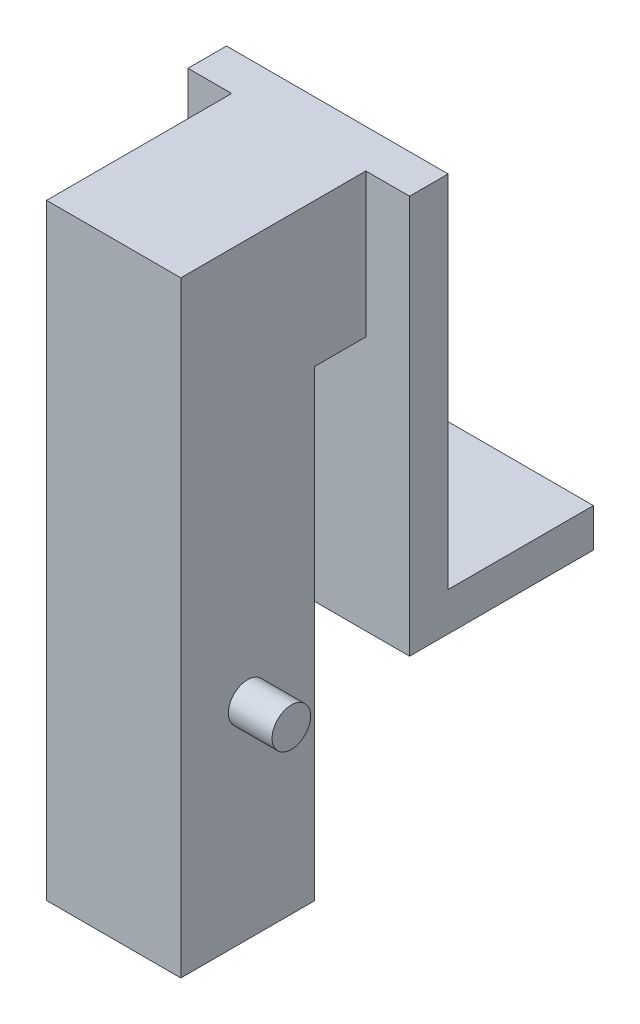
ISO-10303-21;
HEADER;
FILE_DESCRIPTION(('STEP AP214'),'2;1');
FILE_NAME('part.step','',(''),(''),'','','');
FILE_SCHEMA(('AUTOMOTIVE_DESIGN { 1 0 10303 214 1 1 1 1 }'));
ENDSEC;
DATA;
#1=APPLICATION_CONTEXT('core data for automotive mechanical design processes');
#2=APPLICATION_PROTOCOL_DEFINITION('international standard','automotive_design',2000,#1);
#3=PRODUCT_CONTEXT('',#1,'mechanical');
#4=PRODUCT('Part','Part','',(#3));
#5=PRODUCT_RELATED_PRODUCT_CATEGORY('part','',(#4));
#6=PRODUCT_DEFINITION_FORMATION('','',#4);
#7=PRODUCT_DEFINITION_CONTEXT('part definition',#1,'design');
#8=PRODUCT_DEFINITION('design','',#6,#7);
#9=PRODUCT_DEFINITION_SHAPE('','',#8);
#10=(LENGTH_UNIT() NAMED_UNIT(*) SI_UNIT(.MILLI.,.METRE.));
#11=(NAMED_UNIT(*) PLANE_ANGLE_UNIT() SI_UNIT($,.RADIAN.));
#12=(NAMED_UNIT(*) SI_UNIT($,.STERADIAN.) SOLID_ANGLE_UNIT());
#13=UNCERTAINTY_MEASURE_WITH_UNIT(LENGTH_MEASURE(1.E-05),#10,'distance_accuracy_value','');
#14=(GEOMETRIC_REPRESENTATION_CONTEXT(3) GLOBAL_UNCERTAINTY_ASSIGNED_CONTEXT((#13)) GLOBAL_UNIT_ASSIGNED_CONTEXT((#10,
#11,#12)) REPRESENTATION_CONTEXT('',''));
#15=CARTESIAN_POINT('',(0.,0.,0.));
#16=DIRECTION('',(0.,0.,1.));
#17=DIRECTION('',(1.,0.,0.));
#18=AXIS2_PLACEMENT_3D('',#15,#16,#17);
#19=CARTESIAN_POINT('',(-4.35201843167115,39.0974258328658,-10.4));
#20=DIRECTION('',(-1.,0.,0.));
#21=DIRECTION('',(0.,-1.,0.));
#22=AXIS2_PLACEMENT_3D('',#19,#20,#21);
#23=PLANE('',#22);
#24=DIRECTION('',(0.,0.,1.));
#25=VECTOR('',#24,1.);
#26=CARTESIAN_POINT('',(-4.35201843167114,-8.08331982571848,-10.4));
#27=LINE('',#26,#25);
#28=CARTESIAN_POINT('',(-4.35201843167114,-8.08331982571848,-10.4));
#29=VERTEX_POINT('',#28);
#30=CARTESIAN_POINT('',(-4.35201843167114,-8.08331982571848,0.));
#31=VERTEX_POINT('',#30);
#32=EDGE_CURVE('E483',#29,#31,#27,.T.);
#33=ORIENTED_EDGE('',*,*,#32,.T.);
#34=DIRECTION('',(0.,-1.,0.));
#35=VECTOR('',#34,1.);
#36=CARTESIAN_POINT('',(-4.35201843167115,39.0974258328658,0.));
#37=LINE('',#36,#35);
#38=CARTESIAN_POINT('',(-4.35201843167115,39.0974258328658,0.));
#39=VERTEX_POINT('',#38);
#40=EDGE_CURVE('E489',#39,#31,#37,.T.);
#41=ORIENTED_EDGE('',*,*,#40,.F.);
#42=DIRECTION('',(0.,0.,1.));
#43=VECTOR('',#42,1.);
#44=CARTESIAN_POINT('',(-4.35201843167115,39.0974258328658,-10.4));
#45=LINE('',#44,#43);
#46=CARTESIAN_POINT('',(-4.35201843167115,39.0974258328658,-14.4));
#47=VERTEX_POINT('',#46);
#48=EDGE_CURVE('E504',#47,#39,#45,.T.);
#49=ORIENTED_EDGE('',*,*,#48,.F.);
#50=DIRECTION('',(0.,1.,0.));
#51=VECTOR('',#50,1.);
#52=CARTESIAN_POINT('',(-4.35201843167115,27.9166801742815,-14.4));
#53=LINE('',#52,#51);
#54=CARTESIAN_POINT('',(-4.35201843167115,27.9166801742815,-14.4));
#55=VERTEX_POINT('',#54);
#56=EDGE_CURVE('E511',#55,#47,#53,.T.);
#57=ORIENTED_EDGE('',*,*,#56,.F.);
#58=DIRECTION('',(0.,0.,-1.));
#59=VECTOR('',#58,1.);
#60=CARTESIAN_POINT('',(-4.35201843167115,27.9166801742815,-14.4));
#61=LINE('',#60,#59);
#62=CARTESIAN_POINT('',(-4.35201843167115,27.9166801742815,-10.4));
#63=VERTEX_POINT('',#62);
#64=EDGE_CURVE('E515',#63,#55,#61,.T.);
#65=ORIENTED_EDGE('',*,*,#64,.F.);
#66=DIRECTION('',(0.,-1.,0.));
#67=VECTOR('',#66,1.);
#68=CARTESIAN_POINT('',(-4.35201843167115,39.0974258328658,-10.4));
#69=LINE('',#68,#67);
#70=EDGE_CURVE('E497',#63,#29,#69,.T.);
#71=ORIENTED_EDGE('',*,*,#70,.T.);
#72=EDGE_LOOP('',(#33,#41,#49,#57,#65,#71));
#73=FACE_BOUND('',#72,.T.);
#74=CARTESIAN_POINT('',(-4.35201843167115,7.91668017428152,-5.2));
#75=DIRECTION('',(-1.,0.,0.));
#76=DIRECTION('',(0.,-1.,0.));
#77=AXIS2_PLACEMENT_3D('',#74,#75,#76);
#78=CIRCLE('',#77,1.5);
#79=CARTESIAN_POINT('',(-4.35201843167115,6.41668017428152,-5.2));
#80=VERTEX_POINT('',#79);
#81=EDGE_CURVE('E13',#80,#80,#78,.T.);
#82=ORIENTED_EDGE('',*,*,#81,.F.);
#83=EDGE_LOOP('',(#82));
#84=FACE_BOUND('',#83,.T.);
#85=ADVANCED_FACE('F241',(#73,#84),#23,.T.);
#86=CARTESIAN_POINT('',(-4.35201843167115,39.0974258328658,-10.4));
#87=DIRECTION('',(0.,1.,0.));
#88=DIRECTION('',(0.,0.,1.));
#89=AXIS2_PLACEMENT_3D('',#86,#87,#88);
#90=PLANE('',#89);
#91=DIRECTION('',(-1.,0.,0.));
#92=VECTOR('',#91,1.);
#93=CARTESIAN_POINT('',(-4.35201843167115,39.0974258328658,0.));
#94=LINE('',#93,#92);
#95=CARTESIAN_POINT('',(6.09084293443147,39.0974258328658,0.));
#96=VERTEX_POINT('',#95);
#97=EDGE_CURVE('E452',#96,#39,#94,.T.);
#98=ORIENTED_EDGE('',*,*,#97,.F.);
#99=DIRECTION('',(0.,0.,1.));
#100=VECTOR('',#99,1.);
#101=CARTESIAN_POINT('',(6.09084293443147,39.0974258328658,-10.4));
#102=LINE('',#101,#100);
#103=CARTESIAN_POINT('',(6.09084293443147,39.0974258328658,-14.4));
#104=VERTEX_POINT('',#103);
#105=EDGE_CURVE('E499',#104,#96,#102,.T.);
#106=ORIENTED_EDGE('',*,*,#105,.F.);
#107=DIRECTION('',(1.,0.,0.));
#108=VECTOR('',#107,1.);
#109=CARTESIAN_POINT('',(9.49084293443147,39.0974258328658,-14.4));
#110=LINE('',#109,#108);
#111=CARTESIAN_POINT('',(9.49084293443147,39.0974258328658,-14.4));
#112=VERTEX_POINT('',#111);
#113=EDGE_CURVE('E418',#104,#112,#110,.T.);
#114=ORIENTED_EDGE('',*,*,#113,.T.);
#115=DIRECTION('',(0.,0.,1.));
#116=VECTOR('',#115,1.);
#117=CARTESIAN_POINT('',(9.49084293443147,39.0974258328658,-17.4));
#118=LINE('',#117,#116);
#119=CARTESIAN_POINT('',(9.49084293443147,39.0974258328658,-17.4));
#120=VERTEX_POINT('',#119);
#121=EDGE_CURVE('E428',#120,#112,#118,.T.);
#122=ORIENTED_EDGE('',*,*,#121,.F.);
#123=DIRECTION('',(1.,0.,0.));
#124=VECTOR('',#123,1.);
#125=CARTESIAN_POINT('',(9.49084293443147,39.0974258328658,-17.4));
#126=LINE('',#125,#124);
#127=CARTESIAN_POINT('',(-7.75201843167115,39.0974258328658,-17.4));
#128=VERTEX_POINT('',#127);
#129=EDGE_CURVE('E412',#128,#120,#126,.T.);
#130=ORIENTED_EDGE('',*,*,#129,.F.);
#131=DIRECTION('',(0.,0.,1.));
#132=VECTOR('',#131,1.);
#133=CARTESIAN_POINT('',(-7.75201843167115,39.0974258328658,-17.4));
#134=LINE('',#133,#132);
#135=CARTESIAN_POINT('',(-7.75201843167115,39.0974258328658,-14.4));
#136=VERTEX_POINT('',#135);
#137=EDGE_CURVE('E437',#128,#136,#134,.T.);
#138=ORIENTED_EDGE('',*,*,#137,.T.);
#139=EDGE_CURVE('E414',#136,#47,#110,.T.);
#140=ORIENTED_EDGE('',*,*,#139,.T.);
#141=ORIENTED_EDGE('',*,*,#48,.T.);
#142=EDGE_LOOP('',(#98,#106,#114,#122,#130,#138,#140,#141));
#143=FACE_BOUND('',#142,.T.);
#144=ADVANCED_FACE('F450',(#143),#90,.T.);
#145=CARTESIAN_POINT('',(6.09084293443147,39.0974258328658,-10.4));
#146=DIRECTION('',(1.,0.,0.));
#147=DIRECTION('',(0.,1.,0.));
#148=AXIS2_PLACEMENT_3D('',#145,#146,#147);
#149=PLANE('',#148);
#150=DIRECTION('',(0.,1.,0.));
#151=VECTOR('',#150,1.);
#152=CARTESIAN_POINT('',(6.09084293443147,39.0974258328658,-10.4));
#153=LINE('',#152,#151);
#154=CARTESIAN_POINT('',(6.09084293443147,-8.08331982571848,-10.4));
#155=VERTEX_POINT('',#154);
#156=CARTESIAN_POINT('',(6.09084293443147,27.9166801742815,-10.4));
#157=VERTEX_POINT('',#156);
#158=EDGE_CURVE('E501',#155,#157,#153,.T.);
#159=ORIENTED_EDGE('',*,*,#158,.T.);
#160=DIRECTION('',(0.,0.,-1.));
#161=VECTOR('',#160,1.);
#162=CARTESIAN_POINT('',(6.09084293443147,27.9166801742815,-14.4));
#163=LINE('',#162,#161);
#164=CARTESIAN_POINT('',(6.09084293443147,27.9166801742815,-14.4));
#165=VERTEX_POINT('',#164);
#166=EDGE_CURVE('E258',#157,#165,#163,.T.);
#167=ORIENTED_EDGE('',*,*,#166,.T.);
#168=DIRECTION('',(0.,1.,0.));
#169=VECTOR('',#168,1.);
#170=CARTESIAN_POINT('',(6.09084293443147,27.9166801742815,-14.4));
#171=LINE('',#170,#169);
#172=EDGE_CURVE('E439',#165,#104,#171,.T.);
#173=ORIENTED_EDGE('',*,*,#172,.T.);
#174=ORIENTED_EDGE('',*,*,#105,.T.);
#175=DIRECTION('',(0.,1.,0.));
#176=VECTOR('',#175,1.);
#177=CARTESIAN_POINT('',(6.09084293443147,39.0974258328658,0.));
#178=LINE('',#177,#176);
#179=CARTESIAN_POINT('',(6.09084293443147,-8.08331982571848,0.));
#180=VERTEX_POINT('',#179);
#181=EDGE_CURVE('E488',#180,#96,#178,.T.);
#182=ORIENTED_EDGE('',*,*,#181,.F.);
#183=DIRECTION('',(0.,0.,1.));
#184=VECTOR('',#183,1.);
#185=CARTESIAN_POINT('',(6.09084293443147,-8.08331982571848,-10.4));
#186=LINE('',#185,#184);
#187=EDGE_CURVE('E485',#155,#180,#186,.T.);
#188=ORIENTED_EDGE('',*,*,#187,.F.);
#189=EDGE_LOOP('',(#159,#167,#173,#174,#182,#188));
#190=FACE_BOUND('',#189,.T.);
#191=CARTESIAN_POINT('',(6.09084293443147,7.91668017428152,-5.2));
#192=DIRECTION('',(1.,0.,0.));
#193=DIRECTION('',(0.,1.,0.));
#194=AXIS2_PLACEMENT_3D('',#191,#192,#193);
#195=CIRCLE('',#194,1.5);
#196=CARTESIAN_POINT('',(6.09084293443147,9.41668017428152,-5.2));
#197=VERTEX_POINT('',#196);
#198=EDGE_CURVE('E250',#197,#197,#195,.T.);
#199=ORIENTED_EDGE('',*,*,#198,.F.);
#200=EDGE_LOOP('',(#199));
#201=FACE_BOUND('',#200,.T.);
#202=ADVANCED_FACE('F454',(#190,#201),#149,.T.);
#203=CARTESIAN_POINT('',(-4.35201843167114,-8.08331982571848,-10.4));
#204=DIRECTION('',(0.,-1.,0.));
#205=DIRECTION('',(1.,0.,0.));
#206=AXIS2_PLACEMENT_3D('',#203,#204,#205);
#207=PLANE('',#206);
#208=DIRECTION('',(0.,0.,1.));
#209=VECTOR('',#208,1.);
#210=CARTESIAN_POINT('',(3.09084293443148,-8.08331982571848,-3.));
#211=LINE('',#210,#209);
#212=CARTESIAN_POINT('',(3.09084293443148,-8.08331982571848,-7.4));
#213=VERTEX_POINT('',#212);
#214=CARTESIAN_POINT('',(3.09084293443148,-8.08331982571848,-3.));
#215=VERTEX_POINT('',#214);
#216=EDGE_CURVE('E266',#213,#215,#211,.T.);
#217=ORIENTED_EDGE('',*,*,#216,.F.);
#218=DIRECTION('',(1.,0.,0.));
#219=VECTOR('',#218,1.);
#220=CARTESIAN_POINT('',(-1.35201843167114,-8.08331982571848,-7.4));
#221=LINE('',#220,#219);
#222=CARTESIAN_POINT('',(-1.35201843167114,-8.08331982571848,-7.4));
#223=VERTEX_POINT('',#222);
#224=EDGE_CURVE('E534',#223,#213,#221,.T.);
#225=ORIENTED_EDGE('',*,*,#224,.F.);
#226=DIRECTION('',(0.,0.,-1.));
#227=VECTOR('',#226,1.);
#228=CARTESIAN_POINT('',(-1.35201843167114,-8.08331982571848,-3.));
#229=LINE('',#228,#227);
#230=CARTESIAN_POINT('',(-1.35201843167114,-8.08331982571848,-3.));
#231=VERTEX_POINT('',#230);
#232=EDGE_CURVE('E548',#231,#223,#229,.T.);
#233=ORIENTED_EDGE('',*,*,#232,.F.);
#234=DIRECTION('',(-1.,0.,0.));
#235=VECTOR('',#234,1.);
#236=CARTESIAN_POINT('',(-1.35201843167114,-8.08331982571848,-3.));
#237=LINE('',#236,#235);
#238=EDGE_CURVE('E545',#215,#231,#237,.T.);
#239=ORIENTED_EDGE('',*,*,#238,.F.);
#240=EDGE_LOOP('',(#217,#225,#233,#239));
#241=FACE_BOUND('',#240,.T.);
#242=DIRECTION('',(1.,0.,0.));
#243=VECTOR('',#242,1.);
#244=CARTESIAN_POINT('',(-4.35201843167114,-8.08331982571848,0.));
#245=LINE('',#244,#243);
#246=EDGE_CURVE('E480',#31,#180,#245,.T.);
#247=ORIENTED_EDGE('',*,*,#246,.F.);
#248=ORIENTED_EDGE('',*,*,#32,.F.);
#249=DIRECTION('',(1.,0.,0.));
#250=VECTOR('',#249,1.);
#251=CARTESIAN_POINT('',(-4.35201843167114,-8.08331982571848,-10.4));
#252=LINE('',#251,#250);
#253=EDGE_CURVE('E560',#29,#155,#252,.T.);
#254=ORIENTED_EDGE('',*,*,#253,.T.);
#255=ORIENTED_EDGE('',*,*,#187,.T.);
#256=EDGE_LOOP('',(#247,#248,#254,#255));
#257=FACE_BOUND('',#256,.T.);
#258=ADVANCED_FACE('F460',(#241,#257),#207,.T.);
#259=CARTESIAN_POINT('',(0.,0.,-10.4));
#260=DIRECTION('',(0.,0.,1.));
#261=DIRECTION('',(1.,0.,0.));
#262=AXIS2_PLACEMENT_3D('',#259,#260,#261);
#263=PLANE('',#262);
#264=ORIENTED_EDGE('',*,*,#70,.F.);
#265=DIRECTION('',(1.,0.,0.));
#266=VECTOR('',#265,1.);
#267=CARTESIAN_POINT('',(0.,27.9166801742815,-10.4));
#268=LINE('',#267,#266);
#269=EDGE_CURVE('E520',#63,#157,#268,.T.);
#270=ORIENTED_EDGE('',*,*,#269,.T.);
#271=ORIENTED_EDGE('',*,*,#158,.F.);
#272=ORIENTED_EDGE('',*,*,#253,.F.);
#273=EDGE_LOOP('',(#264,#270,#271,#272));
#274=FACE_BOUND('',#273,.T.);
#275=ADVANCED_FACE('F468',(#274),#263,.F.);
#276=CARTESIAN_POINT('',(0.,0.,0.));
#277=DIRECTION('',(0.,0.,1.));
#278=DIRECTION('',(1.,0.,0.));
#279=AXIS2_PLACEMENT_3D('',#276,#277,#278);
#280=PLANE('',#279);
#281=ORIENTED_EDGE('',*,*,#181,.T.);
#282=ORIENTED_EDGE('',*,*,#97,.T.);
#283=ORIENTED_EDGE('',*,*,#40,.T.);
#284=ORIENTED_EDGE('',*,*,#246,.T.);
#285=EDGE_LOOP('',(#281,#282,#283,#284));
#286=FACE_BOUND('',#285,.T.);
#287=ADVANCED_FACE('F465',(#286),#280,.T.);
#288=CARTESIAN_POINT('',(3.09084293443148,16.9166801742815,-3.));
#289=DIRECTION('',(1.,0.,0.));
#290=DIRECTION('',(0.,0.,-1.));
#291=AXIS2_PLACEMENT_3D('',#288,#289,#290);
#292=PLANE('',#291);
#293=ORIENTED_EDGE('',*,*,#216,.T.);
#294=DIRECTION('',(0.,-1.,0.));
#295=VECTOR('',#294,1.);
#296=CARTESIAN_POINT('',(3.09084293443148,16.9166801742815,-3.));
#297=LINE('',#296,#295);
#298=CARTESIAN_POINT('',(3.09084293443148,16.9166801742815,-3.));
#299=VERTEX_POINT('',#298);
#300=EDGE_CURVE('E543',#299,#215,#297,.T.);
#301=ORIENTED_EDGE('',*,*,#300,.F.);
#302=DIRECTION('',(0.,0.,1.));
#303=VECTOR('',#302,1.);
#304=CARTESIAN_POINT('',(3.09084293443148,16.9166801742815,-3.));
#305=LINE('',#304,#303);
#306=CARTESIAN_POINT('',(3.09084293443148,16.9166801742815,-7.4));
#307=VERTEX_POINT('',#306);
#308=EDGE_CURVE('E530',#307,#299,#305,.T.);
#309=ORIENTED_EDGE('',*,*,#308,.F.);
#310=DIRECTION('',(0.,-1.,0.));
#311=VECTOR('',#310,1.);
#312=CARTESIAN_POINT('',(3.09084293443148,16.9166801742815,-7.4));
#313=LINE('',#312,#311);
#314=EDGE_CURVE('E492',#307,#213,#313,.T.);
#315=ORIENTED_EDGE('',*,*,#314,.T.);
#316=EDGE_LOOP('',(#293,#301,#309,#315));
#317=FACE_BOUND('',#316,.T.);
#318=ADVANCED_FACE('F572',(#317),#292,.F.);
#319=CARTESIAN_POINT('',(-1.35201843167114,16.9166801742815,-7.4));
#320=DIRECTION('',(0.,0.,-1.));
#321=DIRECTION('',(-1.,0.,0.));
#322=AXIS2_PLACEMENT_3D('',#319,#320,#321);
#323=PLANE('',#322);
#324=ORIENTED_EDGE('',*,*,#224,.T.);
#325=ORIENTED_EDGE('',*,*,#314,.F.);
#326=DIRECTION('',(1.,0.,0.));
#327=VECTOR('',#326,1.);
#328=CARTESIAN_POINT('',(-1.35201843167114,16.9166801742815,-7.4));
#329=LINE('',#328,#327);
#330=CARTESIAN_POINT('',(-1.35201843167114,16.9166801742815,-7.4));
#331=VERTEX_POINT('',#330);
#332=EDGE_CURVE('E540',#331,#307,#329,.T.);
#333=ORIENTED_EDGE('',*,*,#332,.F.);
#334=DIRECTION('',(0.,-1.,0.));
#335=VECTOR('',#334,1.);
#336=CARTESIAN_POINT('',(-1.35201843167114,16.9166801742815,-7.4));
#337=LINE('',#336,#335);
#338=EDGE_CURVE('E554',#331,#223,#337,.T.);
#339=ORIENTED_EDGE('',*,*,#338,.T.);
#340=EDGE_LOOP('',(#324,#325,#333,#339));
#341=FACE_BOUND('',#340,.T.);
#342=ADVANCED_FACE('F576',(#341),#323,.F.);
#343=CARTESIAN_POINT('',(-1.35201843167114,16.9166801742815,-3.));
#344=DIRECTION('',(-1.,0.,0.));
#345=DIRECTION('',(0.,0.,1.));
#346=AXIS2_PLACEMENT_3D('',#343,#344,#345);
#347=PLANE('',#346);
#348=ORIENTED_EDGE('',*,*,#232,.T.);
#349=ORIENTED_EDGE('',*,*,#338,.F.);
#350=DIRECTION('',(0.,0.,-1.));
#351=VECTOR('',#350,1.);
#352=CARTESIAN_POINT('',(-1.35201843167114,16.9166801742815,-3.));
#353=LINE('',#352,#351);
#354=CARTESIAN_POINT('',(-1.35201843167114,16.9166801742815,-3.));
#355=VERTEX_POINT('',#354);
#356=EDGE_CURVE('E537',#355,#331,#353,.T.);
#357=ORIENTED_EDGE('',*,*,#356,.F.);
#358=DIRECTION('',(0.,-1.,0.));
#359=VECTOR('',#358,1.);
#360=CARTESIAN_POINT('',(-1.35201843167114,16.9166801742815,-3.));
#361=LINE('',#360,#359);
#362=EDGE_CURVE('E556',#355,#231,#361,.T.);
#363=ORIENTED_EDGE('',*,*,#362,.T.);
#364=EDGE_LOOP('',(#348,#349,#357,#363));
#365=FACE_BOUND('',#364,.T.);
#366=ADVANCED_FACE('F581',(#365),#347,.F.);
#367=CARTESIAN_POINT('',(-1.35201843167114,16.9166801742815,-3.));
#368=DIRECTION('',(0.,0.,1.));
#369=DIRECTION('',(1.,0.,0.));
#370=AXIS2_PLACEMENT_3D('',#367,#368,#369);
#371=PLANE('',#370);
#372=ORIENTED_EDGE('',*,*,#238,.T.);
#373=ORIENTED_EDGE('',*,*,#362,.F.);
#374=DIRECTION('',(-1.,0.,0.));
#375=VECTOR('',#374,1.);
#376=CARTESIAN_POINT('',(-1.35201843167114,16.9166801742815,-3.));
#377=LINE('',#376,#375);
#378=EDGE_CURVE('E533',#299,#355,#377,.T.);
#379=ORIENTED_EDGE('',*,*,#378,.F.);
#380=ORIENTED_EDGE('',*,*,#300,.T.);
#381=EDGE_LOOP('',(#372,#373,#379,#380));
#382=FACE_BOUND('',#381,.T.);
#383=ADVANCED_FACE('F585',(#382),#371,.F.);
#384=CARTESIAN_POINT('',(0.,16.9166801742815,0.));
#385=DIRECTION('',(0.,-1.,0.));
#386=DIRECTION('',(0.,0.,-1.));
#387=AXIS2_PLACEMENT_3D('',#384,#385,#386);
#388=PLANE('',#387);
#389=ORIENTED_EDGE('',*,*,#308,.T.);
#390=ORIENTED_EDGE('',*,*,#378,.T.);
#391=ORIENTED_EDGE('',*,*,#356,.T.);
#392=ORIENTED_EDGE('',*,*,#332,.T.);
#393=EDGE_LOOP('',(#389,#390,#391,#392));
#394=FACE_BOUND('',#393,.T.);
#395=ADVANCED_FACE('F588',(#394),#388,.T.);
#396=CARTESIAN_POINT('',(6.09084293443147,7.91668017428152,-5.2));
#397=DIRECTION('',(1.,0.,0.));
#398=DIRECTION('',(0.,1.,0.));
#399=AXIS2_PLACEMENT_3D('',#396,#397,#398);
#400=CYLINDRICAL_SURFACE('',#399,1.5);
#401=CARTESIAN_POINT('',(9.49084293443147,7.91668017428152,-5.2));
#402=DIRECTION('',(1.,0.,0.));
#403=DIRECTION('',(0.,1.,0.));
#404=AXIS2_PLACEMENT_3D('',#401,#402,#403);
#405=CIRCLE('',#404,1.5);
#406=CARTESIAN_POINT('',(9.49084293443147,9.41668017428152,-5.2));
#407=VERTEX_POINT('',#406);
#408=EDGE_CURVE('E526',#407,#407,#405,.T.);
#409=ORIENTED_EDGE('',*,*,#408,.F.);
#410=EDGE_LOOP('',(#409));
#411=FACE_BOUND('',#410,.T.);
#412=ORIENTED_EDGE('',*,*,#198,.T.);
#413=EDGE_LOOP('',(#412));
#414=FACE_BOUND('',#413,.T.);
#415=ADVANCED_FACE('F595',(#411,#414),#400,.T.);
#416=CARTESIAN_POINT('',(9.49084293443147,39.0974258328658,-10.4));
#417=DIRECTION('',(1.,0.,0.));
#418=DIRECTION('',(0.,1.,0.));
#419=AXIS2_PLACEMENT_3D('',#416,#417,#418);
#420=PLANE('',#419);
#421=ORIENTED_EDGE('',*,*,#408,.T.);
#422=EDGE_LOOP('',(#421));
#423=FACE_BOUND('',#422,.T.);
#424=ADVANCED_FACE('F599',(#423),#420,.T.);
#425=CARTESIAN_POINT('',(-4.35201843167115,7.91668017428152,-5.2));
#426=DIRECTION('',(1.,0.,0.));
#427=DIRECTION('',(0.,1.,0.));
#428=AXIS2_PLACEMENT_3D('',#425,#426,#427);
#429=CYLINDRICAL_SURFACE('',#428,1.5);
#430=ORIENTED_EDGE('',*,*,#81,.T.);
#431=EDGE_LOOP('',(#430));
#432=FACE_BOUND('',#431,.T.);
#433=CARTESIAN_POINT('',(-7.75201843167115,7.91668017428152,-5.2));
#434=DIRECTION('',(1.,0.,0.));
#435=DIRECTION('',(0.,1.,0.));
#436=AXIS2_PLACEMENT_3D('',#433,#434,#435);
#437=CIRCLE('',#436,1.5);
#438=CARTESIAN_POINT('',(-7.75201843167115,9.41668017428152,-5.2));
#439=VERTEX_POINT('',#438);
#440=EDGE_CURVE('E522',#439,#439,#437,.T.);
#441=ORIENTED_EDGE('',*,*,#440,.T.);
#442=EDGE_LOOP('',(#441));
#443=FACE_BOUND('',#442,.T.);
#444=ADVANCED_FACE('F603',(#432,#443),#429,.T.);
#445=CARTESIAN_POINT('',(-7.75201843167115,39.0974258328658,-10.4));
#446=DIRECTION('',(-1.,0.,0.));
#447=DIRECTION('',(0.,-1.,0.));
#448=AXIS2_PLACEMENT_3D('',#445,#446,#447);
#449=PLANE('',#448);
#450=ORIENTED_EDGE('',*,*,#440,.F.);
#451=EDGE_LOOP('',(#450));
#452=FACE_BOUND('',#451,.T.);
#453=ADVANCED_FACE('F607',(#452),#449,.T.);
#454=CARTESIAN_POINT('',(-22.5830105462532,27.9166801742815,-14.4));
#455=DIRECTION('',(0.,-1.,0.));
#456=DIRECTION('',(0.,0.,-1.));
#457=AXIS2_PLACEMENT_3D('',#454,#455,#456);
#458=PLANE('',#457);
#459=ORIENTED_EDGE('',*,*,#269,.F.);
#460=ORIENTED_EDGE('',*,*,#64,.T.);
#461=DIRECTION('',(1.,0.,0.));
#462=VECTOR('',#461,1.);
#463=CARTESIAN_POINT('',(-22.5830105462532,27.9166801742815,-14.4));
#464=LINE('',#463,#462);
#465=EDGE_CURVE('E518',#55,#165,#464,.T.);
#466=ORIENTED_EDGE('',*,*,#465,.T.);
#467=ORIENTED_EDGE('',*,*,#166,.F.);
#468=EDGE_LOOP('',(#459,#460,#466,#467));
#469=FACE_BOUND('',#468,.T.);
#470=ADVANCED_FACE('F566',(#469),#458,.T.);
#471=CARTESIAN_POINT('',(0.,0.,-14.4));
#472=DIRECTION('',(0.,0.,-1.));
#473=DIRECTION('',(-1.,0.,0.));
#474=AXIS2_PLACEMENT_3D('',#471,#472,#473);
#475=PLANE('',#474);
#476=ORIENTED_EDGE('',*,*,#465,.F.);
#477=ORIENTED_EDGE('',*,*,#56,.T.);
#478=ORIENTED_EDGE('',*,*,#139,.F.);
#479=DIRECTION('',(0.,1.,0.));
#480=VECTOR('',#479,1.);
#481=CARTESIAN_POINT('',(-7.75201843167115,39.0974258328658,-14.4));
#482=LINE('',#481,#480);
#483=CARTESIAN_POINT('',(-7.75201843167115,8.09742583286584,-14.4));
#484=VERTEX_POINT('',#483);
#485=EDGE_CURVE('E384',#484,#136,#482,.T.);
#486=ORIENTED_EDGE('',*,*,#485,.F.);
#487=DIRECTION('',(-1.,0.,0.));
#488=VECTOR('',#487,1.);
#489=CARTESIAN_POINT('',(-7.75201843167115,8.09742583286584,-14.4));
#490=LINE('',#489,#488);
#491=CARTESIAN_POINT('',(9.49084293443147,8.09742583286584,-14.4));
#492=VERTEX_POINT('',#491);
#493=EDGE_CURVE('E374',#492,#484,#490,.T.);
#494=ORIENTED_EDGE('',*,*,#493,.F.);
#495=DIRECTION('',(0.,-1.,0.));
#496=VECTOR('',#495,1.);
#497=CARTESIAN_POINT('',(9.49084293443147,39.0974258328658,-14.4));
#498=LINE('',#497,#496);
#499=EDGE_CURVE('E382',#112,#492,#498,.T.);
#500=ORIENTED_EDGE('',*,*,#499,.F.);
#501=ORIENTED_EDGE('',*,*,#113,.F.);
#502=ORIENTED_EDGE('',*,*,#172,.F.);
#503=EDGE_LOOP('',(#476,#477,#478,#486,#494,#500,#501,#502));
#504=FACE_BOUND('',#503,.T.);
#505=ADVANCED_FACE('F447',(#504),#475,.F.);
#506=CARTESIAN_POINT('',(9.49084293443147,39.0974258328658,-17.4));
#507=DIRECTION('',(-1.,0.,0.));
#508=DIRECTION('',(0.,-1.,0.));
#509=AXIS2_PLACEMENT_3D('',#506,#507,#508);
#510=PLANE('',#509);
#511=ORIENTED_EDGE('',*,*,#499,.T.);
#512=DIRECTION('',(0.,0.,1.));
#513=VECTOR('',#512,1.);
#514=CARTESIAN_POINT('',(9.49084293443147,8.09742583286584,-14.4));
#515=LINE('',#514,#513);
#516=CARTESIAN_POINT('',(9.49084293443147,8.09742583286584,-28.7050379200646));
#517=VERTEX_POINT('',#516);
#518=EDGE_CURVE('E367',#517,#492,#515,.T.);
#519=ORIENTED_EDGE('',*,*,#518,.F.);
#520=DIRECTION('',(0.,1.,0.));
#521=VECTOR('',#520,1.);
#522=CARTESIAN_POINT('',(9.49084293443147,8.09742583286584,-28.7050379200646));
#523=LINE('',#522,#521);
#524=CARTESIAN_POINT('',(9.49084293443147,11.0974258328658,-28.7050379200646));
#525=VERTEX_POINT('',#524);
#526=EDGE_CURVE('E363',#517,#525,#523,.T.);
#527=ORIENTED_EDGE('',*,*,#526,.T.);
#528=DIRECTION('',(0.,0.,1.));
#529=VECTOR('',#528,1.);
#530=CARTESIAN_POINT('',(9.49084293443147,11.0974258328658,-14.4));
#531=LINE('',#530,#529);
#532=CARTESIAN_POINT('',(9.49084293443147,11.0974258328658,-17.4));
#533=VERTEX_POINT('',#532);
#534=EDGE_CURVE('E376',#525,#533,#531,.T.);
#535=ORIENTED_EDGE('',*,*,#534,.T.);
#536=DIRECTION('',(0.,-1.,0.));
#537=VECTOR('',#536,1.);
#538=CARTESIAN_POINT('',(9.49084293443147,39.0974258328658,-17.4));
#539=LINE('',#538,#537);
#540=EDGE_CURVE('E405',#120,#533,#539,.T.);
#541=ORIENTED_EDGE('',*,*,#540,.F.);
#542=ORIENTED_EDGE('',*,*,#121,.T.);
#543=EDGE_LOOP('',(#511,#519,#527,#535,#541,#542));
#544=FACE_BOUND('',#543,.T.);
#545=ADVANCED_FACE('F403',(#544),#510,.F.);
#546=CARTESIAN_POINT('',(-7.75201843167115,39.0974258328658,-17.4));
#547=DIRECTION('',(1.,0.,0.));
#548=DIRECTION('',(0.,0.,-1.));
#549=AXIS2_PLACEMENT_3D('',#546,#547,#548);
#550=PLANE('',#549);
#551=ORIENTED_EDGE('',*,*,#485,.T.);
#552=ORIENTED_EDGE('',*,*,#137,.F.);
#553=DIRECTION('',(0.,1.,0.));
#554=VECTOR('',#553,1.);
#555=CARTESIAN_POINT('',(-7.75201843167115,39.0974258328658,-17.4));
#556=LINE('',#555,#554);
#557=CARTESIAN_POINT('',(-7.75201843167115,11.0974258328658,-17.4));
#558=VERTEX_POINT('',#557);
#559=EDGE_CURVE('E415',#558,#128,#556,.T.);
#560=ORIENTED_EDGE('',*,*,#559,.F.);
#561=DIRECTION('',(0.,0.,-1.));
#562=VECTOR('',#561,1.);
#563=CARTESIAN_POINT('',(-7.75201843167115,11.0974258328658,-14.4));
#564=LINE('',#563,#562);
#565=CARTESIAN_POINT('',(-7.75201843167115,11.0974258328658,-28.7050379200646));
#566=VERTEX_POINT('',#565);
#567=EDGE_CURVE('E380',#558,#566,#564,.T.);
#568=ORIENTED_EDGE('',*,*,#567,.T.);
#569=DIRECTION('',(0.,1.,0.));
#570=VECTOR('',#569,1.);
#571=CARTESIAN_POINT('',(-7.75201843167115,8.09742583286584,-28.7050379200646));
#572=LINE('',#571,#570);
#573=CARTESIAN_POINT('',(-7.75201843167115,8.09742583286584,-28.7050379200646));
#574=VERTEX_POINT('',#573);
#575=EDGE_CURVE('E361',#574,#566,#572,.T.);
#576=ORIENTED_EDGE('',*,*,#575,.F.);
#577=DIRECTION('',(0.,0.,-1.));
#578=VECTOR('',#577,1.);
#579=CARTESIAN_POINT('',(-7.75201843167115,8.09742583286584,-14.4));
#580=LINE('',#579,#578);
#581=EDGE_CURVE('E368',#484,#574,#580,.T.);
#582=ORIENTED_EDGE('',*,*,#581,.F.);
#583=EDGE_LOOP('',(#551,#552,#560,#568,#576,#582));
#584=FACE_BOUND('',#583,.T.);
#585=ADVANCED_FACE('F378',(#584),#550,.F.);
#586=CARTESIAN_POINT('',(0.,0.,-17.4));
#587=DIRECTION('',(0.,0.,-1.));
#588=DIRECTION('',(-1.,0.,0.));
#589=AXIS2_PLACEMENT_3D('',#586,#587,#588);
#590=PLANE('',#589);
#591=ORIENTED_EDGE('',*,*,#540,.T.);
#592=DIRECTION('',(-1.,0.,0.));
#593=VECTOR('',#592,1.);
#594=CARTESIAN_POINT('',(9.49084293443147,11.0974258328658,-17.4));
#595=LINE('',#594,#593);
#596=EDGE_CURVE('E410',#533,#558,#595,.T.);
#597=ORIENTED_EDGE('',*,*,#596,.T.);
#598=ORIENTED_EDGE('',*,*,#559,.T.);
#599=ORIENTED_EDGE('',*,*,#129,.T.);
#600=EDGE_LOOP('',(#591,#597,#598,#599));
#601=FACE_BOUND('',#600,.T.);
#602=ADVANCED_FACE('F409',(#601),#590,.T.);
#603=CARTESIAN_POINT('',(-7.75201843167115,8.09742583286584,-28.7050379200646));
#604=DIRECTION('',(0.,0.,1.));
#605=DIRECTION('',(1.,0.,0.));
#606=AXIS2_PLACEMENT_3D('',#603,#604,#605);
#607=PLANE('',#606);
#608=DIRECTION('',(1.,0.,0.));
#609=VECTOR('',#608,1.);
#610=CARTESIAN_POINT('',(-7.75201843167115,11.0974258328658,-28.7050379200646));
#611=LINE('',#610,#609);
#612=EDGE_CURVE('E391',#566,#525,#611,.T.);
#613=ORIENTED_EDGE('',*,*,#612,.T.);
#614=ORIENTED_EDGE('',*,*,#526,.F.);
#615=DIRECTION('',(1.,0.,0.));
#616=VECTOR('',#615,1.);
#617=CARTESIAN_POINT('',(-7.75201843167115,8.09742583286584,-28.7050379200646));
#618=LINE('',#617,#616);
#619=EDGE_CURVE('E357',#574,#517,#618,.T.);
#620=ORIENTED_EDGE('',*,*,#619,.F.);
#621=ORIENTED_EDGE('',*,*,#575,.T.);
#622=EDGE_LOOP('',(#613,#614,#620,#621));
#623=FACE_BOUND('',#622,.T.);
#624=ADVANCED_FACE('F359',(#623),#607,.F.);
#625=CARTESIAN_POINT('',(0.,8.09742583286584,0.));
#626=DIRECTION('',(0.,-1.,0.));
#627=DIRECTION('',(0.,0.,-1.));
#628=AXIS2_PLACEMENT_3D('',#625,#626,#627);
#629=PLANE('',#628);
#630=ORIENTED_EDGE('',*,*,#581,.T.);
#631=ORIENTED_EDGE('',*,*,#619,.T.);
#632=ORIENTED_EDGE('',*,*,#518,.T.);
#633=ORIENTED_EDGE('',*,*,#493,.T.);
#634=EDGE_LOOP('',(#630,#631,#632,#633));
#635=FACE_BOUND('',#634,.T.);
#636=ADVANCED_FACE('F372',(#635),#629,.T.);
#637=CARTESIAN_POINT('',(0.,11.0974258328658,0.));
#638=DIRECTION('',(0.,-1.,0.));
#639=DIRECTION('',(0.,0.,-1.));
#640=AXIS2_PLACEMENT_3D('',#637,#638,#639);
#641=PLANE('',#640);
#642=ORIENTED_EDGE('',*,*,#596,.F.);
#643=ORIENTED_EDGE('',*,*,#534,.F.);
#644=ORIENTED_EDGE('',*,*,#612,.F.);
#645=ORIENTED_EDGE('',*,*,#567,.F.);
#646=EDGE_LOOP('',(#642,#643,#644,#645));
#647=FACE_BOUND('',#646,.T.);
#648=ADVANCED_FACE('F624',(#647),#641,.F.);
#649=CLOSED_SHELL('',(#85,#144,#202,#258,#275,#287,#318,#342,#366,#383,#395,#415,#424,#444,#453,
#470,#505,#545,#585,#602,#624,#636,#648));
#650=MANIFOLD_SOLID_BREP('B2',#649);
#651=ADVANCED_BREP_SHAPE_REPRESENTATION('',(#18,#650),#14);
#652=SHAPE_DEFINITION_REPRESENTATION(#9,#651);
ENDSEC;
END-ISO-10303-21;
